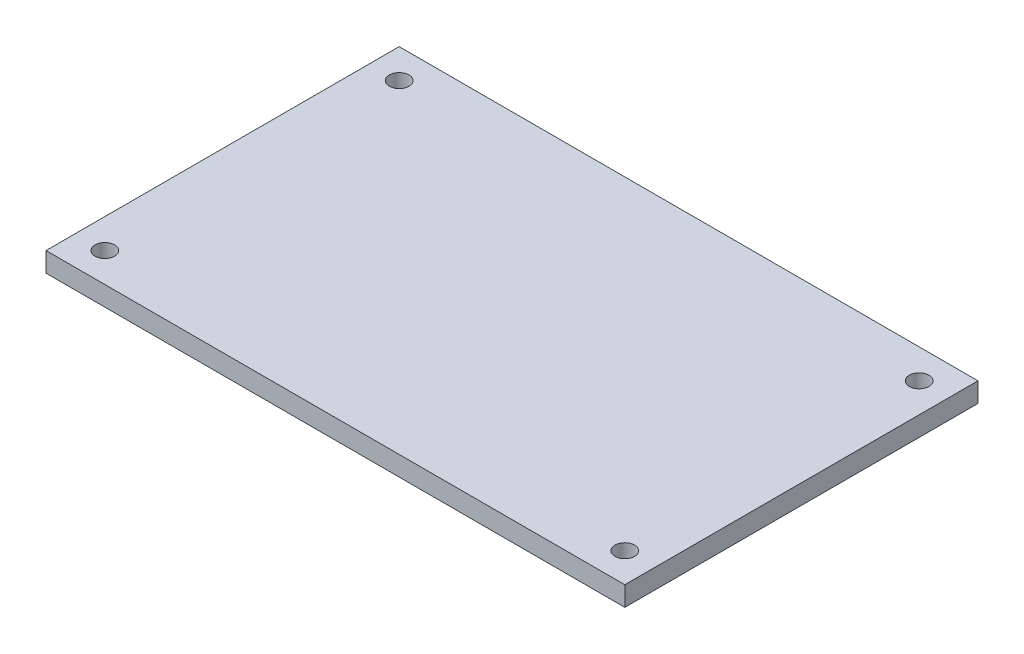
ISO-10303-21;
HEADER;
FILE_DESCRIPTION(('STEP AP214'),'2;1');
FILE_NAME('part.step','',(''),(''),'','','');
FILE_SCHEMA(('AUTOMOTIVE_DESIGN { 1 0 10303 214 1 1 1 1 }'));
ENDSEC;
DATA;
#1=APPLICATION_CONTEXT('core data for automotive mechanical design processes');
#2=APPLICATION_PROTOCOL_DEFINITION('international standard','automotive_design',2000,#1);
#3=PRODUCT_CONTEXT('',#1,'mechanical');
#4=PRODUCT('Part','Part','',(#3));
#5=PRODUCT_RELATED_PRODUCT_CATEGORY('part','',(#4));
#6=PRODUCT_DEFINITION_FORMATION('','',#4);
#7=PRODUCT_DEFINITION_CONTEXT('part definition',#1,'design');
#8=PRODUCT_DEFINITION('design','',#6,#7);
#9=PRODUCT_DEFINITION_SHAPE('','',#8);
#10=(LENGTH_UNIT() NAMED_UNIT(*) SI_UNIT(.MILLI.,.METRE.));
#11=(NAMED_UNIT(*) PLANE_ANGLE_UNIT() SI_UNIT($,.RADIAN.));
#12=(NAMED_UNIT(*) SI_UNIT($,.STERADIAN.) SOLID_ANGLE_UNIT());
#13=UNCERTAINTY_MEASURE_WITH_UNIT(LENGTH_MEASURE(1.E-05),#10,'distance_accuracy_value','');
#14=(GEOMETRIC_REPRESENTATION_CONTEXT(3) GLOBAL_UNCERTAINTY_ASSIGNED_CONTEXT((#13)) GLOBAL_UNIT_ASSIGNED_CONTEXT((#10,
#11,#12)) REPRESENTATION_CONTEXT('',''));
#15=CARTESIAN_POINT('',(0.,0.,0.));
#16=DIRECTION('',(0.,0.,1.));
#17=DIRECTION('',(1.,0.,0.));
#18=AXIS2_PLACEMENT_3D('',#15,#16,#17);
#19=CARTESIAN_POINT('',(187.325,12.7,-114.3));
#20=DIRECTION('',(-1.,0.,0.));
#21=DIRECTION('',(0.,0.,1.));
#22=AXIS2_PLACEMENT_3D('',#19,#20,#21);
#23=PLANE('',#22);
#24=DIRECTION('',(0.,0.,-1.));
#25=VECTOR('',#24,1.);
#26=CARTESIAN_POINT('',(187.325,0.,-114.3));
#27=LINE('',#26,#25);
#28=CARTESIAN_POINT('',(187.325,0.,114.3));
#29=VERTEX_POINT('',#28);
#30=CARTESIAN_POINT('',(187.325,0.,-114.3));
#31=VERTEX_POINT('',#30);
#32=EDGE_CURVE('E96',#29,#31,#27,.T.);
#33=ORIENTED_EDGE('',*,*,#32,.T.);
#34=DIRECTION('',(0.,-1.,0.));
#35=VECTOR('',#34,1.);
#36=CARTESIAN_POINT('',(187.325,12.7,-114.3));
#37=LINE('',#36,#35);
#38=CARTESIAN_POINT('',(187.325,12.7,-114.3));
#39=VERTEX_POINT('',#38);
#40=EDGE_CURVE('E11',#39,#31,#37,.T.);
#41=ORIENTED_EDGE('',*,*,#40,.F.);
#42=DIRECTION('',(0.,0.,-1.));
#43=VECTOR('',#42,1.);
#44=CARTESIAN_POINT('',(187.325,12.7,-114.3));
#45=LINE('',#44,#43);
#46=CARTESIAN_POINT('',(187.325,12.7,114.3));
#47=VERTEX_POINT('',#46);
#48=EDGE_CURVE('E84',#47,#39,#45,.T.);
#49=ORIENTED_EDGE('',*,*,#48,.F.);
#50=DIRECTION('',(0.,-1.,0.));
#51=VECTOR('',#50,1.);
#52=CARTESIAN_POINT('',(187.325,12.7,114.3));
#53=LINE('',#52,#51);
#54=EDGE_CURVE('E92',#47,#29,#53,.T.);
#55=ORIENTED_EDGE('',*,*,#54,.T.);
#56=EDGE_LOOP('',(#33,#41,#49,#55));
#57=FACE_BOUND('',#56,.T.);
#58=ADVANCED_FACE('F33',(#57),#23,.F.);
#59=CARTESIAN_POINT('',(-187.325,12.7,-114.3));
#60=DIRECTION('',(0.,0.,1.));
#61=DIRECTION('',(1.,0.,0.));
#62=AXIS2_PLACEMENT_3D('',#59,#60,#61);
#63=PLANE('',#62);
#64=DIRECTION('',(-1.,0.,0.));
#65=VECTOR('',#64,1.);
#66=CARTESIAN_POINT('',(-187.325,0.,-114.3));
#67=LINE('',#66,#65);
#68=CARTESIAN_POINT('',(-187.325,0.,-114.3));
#69=VERTEX_POINT('',#68);
#70=EDGE_CURVE('E88',#31,#69,#67,.T.);
#71=ORIENTED_EDGE('',*,*,#70,.T.);
#72=DIRECTION('',(0.,-1.,0.));
#73=VECTOR('',#72,1.);
#74=CARTESIAN_POINT('',(-187.325,12.7,-114.3));
#75=LINE('',#74,#73);
#76=CARTESIAN_POINT('',(-187.325,12.7,-114.3));
#77=VERTEX_POINT('',#76);
#78=EDGE_CURVE('E41',#77,#69,#75,.T.);
#79=ORIENTED_EDGE('',*,*,#78,.F.);
#80=DIRECTION('',(-1.,0.,0.));
#81=VECTOR('',#80,1.);
#82=CARTESIAN_POINT('',(-187.325,12.7,-114.3));
#83=LINE('',#82,#81);
#84=EDGE_CURVE('E79',#39,#77,#83,.T.);
#85=ORIENTED_EDGE('',*,*,#84,.F.);
#86=ORIENTED_EDGE('',*,*,#40,.T.);
#87=EDGE_LOOP('',(#71,#79,#85,#86));
#88=FACE_BOUND('',#87,.T.);
#89=ADVANCED_FACE('F87',(#88),#63,.F.);
#90=CARTESIAN_POINT('',(-187.325,12.7,-114.3));
#91=DIRECTION('',(1.,0.,0.));
#92=DIRECTION('',(0.,0.,-1.));
#93=AXIS2_PLACEMENT_3D('',#90,#91,#92);
#94=PLANE('',#93);
#95=DIRECTION('',(0.,0.,1.));
#96=VECTOR('',#95,1.);
#97=CARTESIAN_POINT('',(-187.325,0.,-114.3));
#98=LINE('',#97,#96);
#99=CARTESIAN_POINT('',(-187.325,0.,114.3));
#100=VERTEX_POINT('',#99);
#101=EDGE_CURVE('E66',#69,#100,#98,.T.);
#102=ORIENTED_EDGE('',*,*,#101,.T.);
#103=DIRECTION('',(0.,-1.,0.));
#104=VECTOR('',#103,1.);
#105=CARTESIAN_POINT('',(-187.325,12.7,114.3));
#106=LINE('',#105,#104);
#107=CARTESIAN_POINT('',(-187.325,12.7,114.3));
#108=VERTEX_POINT('',#107);
#109=EDGE_CURVE('E89',#108,#100,#106,.T.);
#110=ORIENTED_EDGE('',*,*,#109,.F.);
#111=DIRECTION('',(0.,0.,1.));
#112=VECTOR('',#111,1.);
#113=CARTESIAN_POINT('',(-187.325,12.7,-114.3));
#114=LINE('',#113,#112);
#115=EDGE_CURVE('E82',#77,#108,#114,.T.);
#116=ORIENTED_EDGE('',*,*,#115,.F.);
#117=ORIENTED_EDGE('',*,*,#78,.T.);
#118=EDGE_LOOP('',(#102,#110,#116,#117));
#119=FACE_BOUND('',#118,.T.);
#120=ADVANCED_FACE('F90',(#119),#94,.F.);
#121=CARTESIAN_POINT('',(-187.325,12.7,114.3));
#122=DIRECTION('',(0.,0.,-1.));
#123=DIRECTION('',(-1.,0.,0.));
#124=AXIS2_PLACEMENT_3D('',#121,#122,#123);
#125=PLANE('',#124);
#126=DIRECTION('',(1.,0.,0.));
#127=VECTOR('',#126,1.);
#128=CARTESIAN_POINT('',(-187.325,0.,114.3));
#129=LINE('',#128,#127);
#130=EDGE_CURVE('E72',#100,#29,#129,.T.);
#131=ORIENTED_EDGE('',*,*,#130,.T.);
#132=ORIENTED_EDGE('',*,*,#54,.F.);
#133=DIRECTION('',(1.,0.,0.));
#134=VECTOR('',#133,1.);
#135=CARTESIAN_POINT('',(-187.325,12.7,114.3));
#136=LINE('',#135,#134);
#137=EDGE_CURVE('E49',#108,#47,#136,.T.);
#138=ORIENTED_EDGE('',*,*,#137,.F.);
#139=ORIENTED_EDGE('',*,*,#109,.T.);
#140=EDGE_LOOP('',(#131,#132,#138,#139));
#141=FACE_BOUND('',#140,.T.);
#142=ADVANCED_FACE('F104',(#141),#125,.F.);
#143=CARTESIAN_POINT('',(0.,12.7,0.));
#144=DIRECTION('',(0.,1.,0.));
#145=DIRECTION('',(0.,0.,1.));
#146=AXIS2_PLACEMENT_3D('',#143,#144,#145);
#147=PLANE('',#146);
#148=CARTESIAN_POINT('',(-168.275,12.7,-95.25));
#149=DIRECTION('',(0.,1.,0.));
#150=DIRECTION('',(0.,0.,1.));
#151=AXIS2_PLACEMENT_3D('',#148,#149,#150);
#152=CIRCLE('',#151,6.34999999999999);
#153=CARTESIAN_POINT('',(-168.275,12.7,-88.9));
#154=VERTEX_POINT('',#153);
#155=EDGE_CURVE('E130',#154,#154,#152,.T.);
#156=ORIENTED_EDGE('',*,*,#155,.F.);
#157=EDGE_LOOP('',(#156));
#158=FACE_BOUND('',#157,.T.);
#159=CARTESIAN_POINT('',(-168.275,12.7,95.25));
#160=DIRECTION('',(0.,1.,0.));
#161=DIRECTION('',(0.,0.,1.));
#162=AXIS2_PLACEMENT_3D('',#159,#160,#161);
#163=CIRCLE('',#162,6.34999999999999);
#164=CARTESIAN_POINT('',(-168.275,12.7,101.6));
#165=VERTEX_POINT('',#164);
#166=EDGE_CURVE('E124',#165,#165,#163,.T.);
#167=ORIENTED_EDGE('',*,*,#166,.F.);
#168=EDGE_LOOP('',(#167));
#169=FACE_BOUND('',#168,.T.);
#170=CARTESIAN_POINT('',(168.275,12.7,95.25));
#171=DIRECTION('',(0.,1.,0.));
#172=DIRECTION('',(0.,0.,1.));
#173=AXIS2_PLACEMENT_3D('',#170,#171,#172);
#174=CIRCLE('',#173,6.34999999999999);
#175=CARTESIAN_POINT('',(168.275,12.7,101.6));
#176=VERTEX_POINT('',#175);
#177=EDGE_CURVE('E118',#176,#176,#174,.T.);
#178=ORIENTED_EDGE('',*,*,#177,.F.);
#179=EDGE_LOOP('',(#178));
#180=FACE_BOUND('',#179,.T.);
#181=CARTESIAN_POINT('',(168.275,12.7,-95.25));
#182=DIRECTION('',(0.,1.,0.));
#183=DIRECTION('',(0.,0.,1.));
#184=AXIS2_PLACEMENT_3D('',#181,#182,#183);
#185=CIRCLE('',#184,6.34999999999999);
#186=CARTESIAN_POINT('',(168.275,12.7,-88.9));
#187=VERTEX_POINT('',#186);
#188=EDGE_CURVE('E112',#187,#187,#185,.T.);
#189=ORIENTED_EDGE('',*,*,#188,.F.);
#190=EDGE_LOOP('',(#189));
#191=FACE_BOUND('',#190,.T.);
#192=ORIENTED_EDGE('',*,*,#48,.T.);
#193=ORIENTED_EDGE('',*,*,#84,.T.);
#194=ORIENTED_EDGE('',*,*,#115,.T.);
#195=ORIENTED_EDGE('',*,*,#137,.T.);
#196=EDGE_LOOP('',(#192,#193,#194,#195));
#197=FACE_BOUND('',#196,.T.);
#198=ADVANCED_FACE('F80',(#158,#169,#180,#191,#197),#147,.T.);
#199=CARTESIAN_POINT('',(0.,0.,0.));
#200=DIRECTION('',(0.,1.,0.));
#201=DIRECTION('',(0.,0.,1.));
#202=AXIS2_PLACEMENT_3D('',#199,#200,#201);
#203=PLANE('',#202);
#204=CARTESIAN_POINT('',(-168.275,0.,-95.25));
#205=DIRECTION('',(0.,1.,0.));
#206=DIRECTION('',(0.,0.,1.));
#207=AXIS2_PLACEMENT_3D('',#204,#205,#206);
#208=CIRCLE('',#207,6.34999999999999);
#209=CARTESIAN_POINT('',(-168.275,0.,-88.9));
#210=VERTEX_POINT('',#209);
#211=EDGE_CURVE('E127',#210,#210,#208,.T.);
#212=ORIENTED_EDGE('',*,*,#211,.T.);
#213=EDGE_LOOP('',(#212));
#214=FACE_BOUND('',#213,.T.);
#215=CARTESIAN_POINT('',(-168.275,0.,95.25));
#216=DIRECTION('',(0.,1.,0.));
#217=DIRECTION('',(0.,0.,1.));
#218=AXIS2_PLACEMENT_3D('',#215,#216,#217);
#219=CIRCLE('',#218,6.34999999999999);
#220=CARTESIAN_POINT('',(-168.275,0.,101.6));
#221=VERTEX_POINT('',#220);
#222=EDGE_CURVE('E121',#221,#221,#219,.T.);
#223=ORIENTED_EDGE('',*,*,#222,.T.);
#224=EDGE_LOOP('',(#223));
#225=FACE_BOUND('',#224,.T.);
#226=CARTESIAN_POINT('',(168.275,0.,95.25));
#227=DIRECTION('',(0.,1.,0.));
#228=DIRECTION('',(0.,0.,1.));
#229=AXIS2_PLACEMENT_3D('',#226,#227,#228);
#230=CIRCLE('',#229,6.34999999999999);
#231=CARTESIAN_POINT('',(168.275,0.,101.6));
#232=VERTEX_POINT('',#231);
#233=EDGE_CURVE('E115',#232,#232,#230,.T.);
#234=ORIENTED_EDGE('',*,*,#233,.T.);
#235=EDGE_LOOP('',(#234));
#236=FACE_BOUND('',#235,.T.);
#237=CARTESIAN_POINT('',(168.275,0.,-95.25));
#238=DIRECTION('',(0.,1.,0.));
#239=DIRECTION('',(0.,0.,1.));
#240=AXIS2_PLACEMENT_3D('',#237,#238,#239);
#241=CIRCLE('',#240,6.34999999999999);
#242=CARTESIAN_POINT('',(168.275,0.,-88.9));
#243=VERTEX_POINT('',#242);
#244=EDGE_CURVE('E99',#243,#243,#241,.T.);
#245=ORIENTED_EDGE('',*,*,#244,.T.);
#246=EDGE_LOOP('',(#245));
#247=FACE_BOUND('',#246,.T.);
#248=ORIENTED_EDGE('',*,*,#32,.F.);
#249=ORIENTED_EDGE('',*,*,#130,.F.);
#250=ORIENTED_EDGE('',*,*,#101,.F.);
#251=ORIENTED_EDGE('',*,*,#70,.F.);
#252=EDGE_LOOP('',(#248,#249,#250,#251));
#253=FACE_BOUND('',#252,.T.);
#254=ADVANCED_FACE('F107',(#214,#225,#236,#247,#253),#203,.F.);
#255=CARTESIAN_POINT('',(168.275,12.7,-95.25));
#256=DIRECTION('',(0.,1.,0.));
#257=DIRECTION('',(0.,0.,1.));
#258=AXIS2_PLACEMENT_3D('',#255,#256,#257);
#259=CYLINDRICAL_SURFACE('',#258,6.34999999999999);
#260=ORIENTED_EDGE('',*,*,#244,.F.);
#261=EDGE_LOOP('',(#260));
#262=FACE_BOUND('',#261,.T.);
#263=ORIENTED_EDGE('',*,*,#188,.T.);
#264=EDGE_LOOP('',(#263));
#265=FACE_BOUND('',#264,.T.);
#266=ADVANCED_FACE('F145',(#262,#265),#259,.F.);
#267=CARTESIAN_POINT('',(168.275,12.7,95.25));
#268=DIRECTION('',(0.,1.,0.));
#269=DIRECTION('',(0.,0.,1.));
#270=AXIS2_PLACEMENT_3D('',#267,#268,#269);
#271=CYLINDRICAL_SURFACE('',#270,6.34999999999999);
#272=ORIENTED_EDGE('',*,*,#233,.F.);
#273=EDGE_LOOP('',(#272));
#274=FACE_BOUND('',#273,.T.);
#275=ORIENTED_EDGE('',*,*,#177,.T.);
#276=EDGE_LOOP('',(#275));
#277=FACE_BOUND('',#276,.T.);
#278=ADVANCED_FACE('F147',(#274,#277),#271,.F.);
#279=CARTESIAN_POINT('',(-168.275,12.7,95.25));
#280=DIRECTION('',(0.,1.,0.));
#281=DIRECTION('',(0.,0.,1.));
#282=AXIS2_PLACEMENT_3D('',#279,#280,#281);
#283=CYLINDRICAL_SURFACE('',#282,6.34999999999999);
#284=ORIENTED_EDGE('',*,*,#222,.F.);
#285=EDGE_LOOP('',(#284));
#286=FACE_BOUND('',#285,.T.);
#287=ORIENTED_EDGE('',*,*,#166,.T.);
#288=EDGE_LOOP('',(#287));
#289=FACE_BOUND('',#288,.T.);
#290=ADVANCED_FACE('F154',(#286,#289),#283,.F.);
#291=CARTESIAN_POINT('',(-168.275,12.7,-95.25));
#292=DIRECTION('',(0.,1.,0.));
#293=DIRECTION('',(0.,0.,1.));
#294=AXIS2_PLACEMENT_3D('',#291,#292,#293);
#295=CYLINDRICAL_SURFACE('',#294,6.34999999999999);
#296=ORIENTED_EDGE('',*,*,#211,.F.);
#297=EDGE_LOOP('',(#296));
#298=FACE_BOUND('',#297,.T.);
#299=ORIENTED_EDGE('',*,*,#155,.T.);
#300=EDGE_LOOP('',(#299));
#301=FACE_BOUND('',#300,.T.);
#302=ADVANCED_FACE('F134',(#298,#301),#295,.F.);
#303=CLOSED_SHELL('',(#58,#89,#120,#142,#198,#254,#266,#278,#290,#302));
#304=MANIFOLD_SOLID_BREP('B2',#303);
#305=ADVANCED_BREP_SHAPE_REPRESENTATION('',(#18,#304),#14);
#306=SHAPE_DEFINITION_REPRESENTATION(#9,#305);
ENDSEC;
END-ISO-10303-21;
